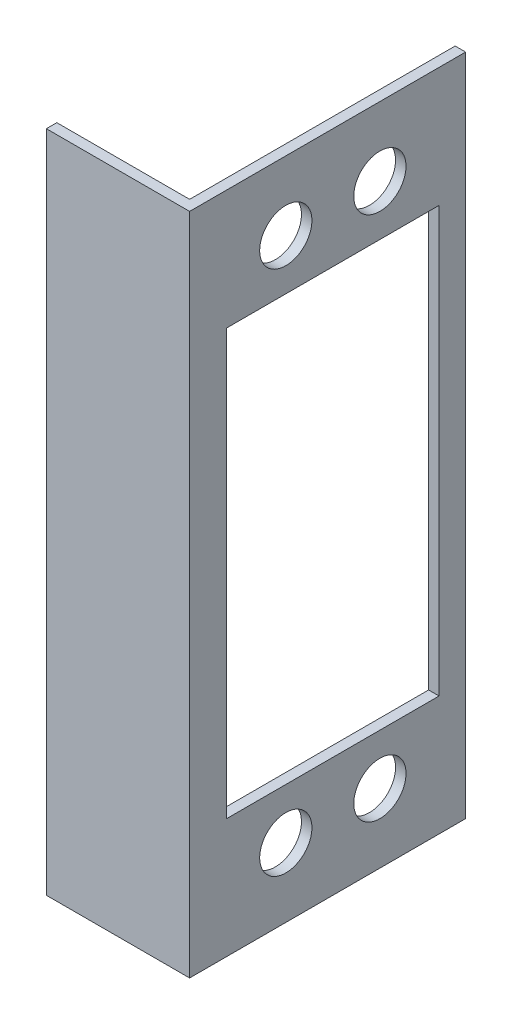
ISO-10303-21;
HEADER;
FILE_DESCRIPTION(('STEP AP214'),'2;1');
FILE_NAME('part.step','',(''),(''),'','','');
FILE_SCHEMA(('AUTOMOTIVE_DESIGN { 1 0 10303 214 1 1 1 1 }'));
ENDSEC;
DATA;
#1=APPLICATION_CONTEXT('core data for automotive mechanical design processes');
#2=APPLICATION_PROTOCOL_DEFINITION('international standard','automotive_design',2000,#1);
#3=PRODUCT_CONTEXT('',#1,'mechanical');
#4=PRODUCT('Part','Part','',(#3));
#5=PRODUCT_RELATED_PRODUCT_CATEGORY('part','',(#4));
#6=PRODUCT_DEFINITION_FORMATION('','',#4);
#7=PRODUCT_DEFINITION_CONTEXT('part definition',#1,'design');
#8=PRODUCT_DEFINITION('design','',#6,#7);
#9=PRODUCT_DEFINITION_SHAPE('','',#8);
#10=(LENGTH_UNIT() NAMED_UNIT(*) SI_UNIT(.MILLI.,.METRE.));
#11=(NAMED_UNIT(*) PLANE_ANGLE_UNIT() SI_UNIT($,.RADIAN.));
#12=(NAMED_UNIT(*) SI_UNIT($,.STERADIAN.) SOLID_ANGLE_UNIT());
#13=UNCERTAINTY_MEASURE_WITH_UNIT(LENGTH_MEASURE(1.E-05),#10,'distance_accuracy_value','');
#14=(GEOMETRIC_REPRESENTATION_CONTEXT(3) GLOBAL_UNCERTAINTY_ASSIGNED_CONTEXT((#13)) GLOBAL_UNIT_ASSIGNED_CONTEXT((#10,
#11,#12)) REPRESENTATION_CONTEXT('',''));
#15=CARTESIAN_POINT('',(0.,0.,0.));
#16=DIRECTION('',(0.,0.,1.));
#17=DIRECTION('',(1.,0.,0.));
#18=AXIS2_PLACEMENT_3D('',#15,#16,#17);
#19=CARTESIAN_POINT('',(12.7,63.5,0.));
#20=DIRECTION('',(-1.,0.,0.));
#21=DIRECTION('',(0.,0.,1.));
#22=AXIS2_PLACEMENT_3D('',#19,#20,#21);
#23=PLANE('',#22);
#24=CARTESIAN_POINT('',(12.7,6.6,-9.20000000000001));
#25=DIRECTION('',(-1.,0.,0.));
#26=DIRECTION('',(0.,0.,1.));
#27=AXIS2_PLACEMENT_3D('',#24,#25,#26);
#28=CIRCLE('',#27,2.5);
#29=CARTESIAN_POINT('',(12.7,6.6,-6.70000000000001));
#30=VERTEX_POINT('',#29);
#31=EDGE_CURVE('E235',#30,#30,#28,.T.);
#32=ORIENTED_EDGE('',*,*,#31,.F.);
#33=EDGE_LOOP('',(#32));
#34=FACE_BOUND('',#33,.T.);
#35=CARTESIAN_POINT('',(12.7,56.9,-18.2));
#36=DIRECTION('',(-1.,0.,0.));
#37=DIRECTION('',(0.,0.,1.));
#38=AXIS2_PLACEMENT_3D('',#35,#36,#37);
#39=CIRCLE('',#38,2.5);
#40=CARTESIAN_POINT('',(12.7,56.9,-15.7));
#41=VERTEX_POINT('',#40);
#42=EDGE_CURVE('E239',#41,#41,#39,.T.);
#43=ORIENTED_EDGE('',*,*,#42,.F.);
#44=EDGE_LOOP('',(#43));
#45=FACE_BOUND('',#44,.T.);
#46=CARTESIAN_POINT('',(12.7,56.9,-9.20000000000001));
#47=DIRECTION('',(-1.,0.,0.));
#48=DIRECTION('',(0.,0.,1.));
#49=AXIS2_PLACEMENT_3D('',#46,#47,#48);
#50=CIRCLE('',#49,2.5);
#51=CARTESIAN_POINT('',(12.7,56.9,-6.7));
#52=VERTEX_POINT('',#51);
#53=EDGE_CURVE('E243',#52,#52,#50,.T.);
#54=ORIENTED_EDGE('',*,*,#53,.F.);
#55=EDGE_LOOP('',(#54));
#56=FACE_BOUND('',#55,.T.);
#57=CARTESIAN_POINT('',(12.7,6.6,-18.2));
#58=DIRECTION('',(-1.,0.,0.));
#59=DIRECTION('',(0.,0.,1.));
#60=AXIS2_PLACEMENT_3D('',#57,#58,#59);
#61=CIRCLE('',#60,2.5);
#62=CARTESIAN_POINT('',(12.7,6.6,-15.7));
#63=VERTEX_POINT('',#62);
#64=EDGE_CURVE('E247',#63,#63,#61,.T.);
#65=ORIENTED_EDGE('',*,*,#64,.F.);
#66=EDGE_LOOP('',(#65));
#67=FACE_BOUND('',#66,.T.);
#68=DIRECTION('',(0.,-1.,0.));
#69=VECTOR('',#68,1.);
#70=CARTESIAN_POINT('',(12.7,52.07,-23.86));
#71=LINE('',#70,#69);
#72=CARTESIAN_POINT('',(12.7,52.07,-23.86));
#73=VERTEX_POINT('',#72);
#74=CARTESIAN_POINT('',(12.7,11.43,-23.86));
#75=VERTEX_POINT('',#74);
#76=EDGE_CURVE('E49',#73,#75,#71,.T.);
#77=ORIENTED_EDGE('',*,*,#76,.F.);
#78=DIRECTION('',(0.,0.,-1.));
#79=VECTOR('',#78,1.);
#80=CARTESIAN_POINT('',(12.7,52.07,-23.86));
#81=LINE('',#80,#79);
#82=CARTESIAN_POINT('',(12.7,52.07,-3.54));
#83=VERTEX_POINT('',#82);
#84=EDGE_CURVE('E128',#83,#73,#81,.T.);
#85=ORIENTED_EDGE('',*,*,#84,.F.);
#86=DIRECTION('',(0.,1.,0.));
#87=VECTOR('',#86,1.);
#88=CARTESIAN_POINT('',(12.7,52.07,-3.54));
#89=LINE('',#88,#87);
#90=CARTESIAN_POINT('',(12.7,11.43,-3.54));
#91=VERTEX_POINT('',#90);
#92=EDGE_CURVE('E131',#91,#83,#89,.T.);
#93=ORIENTED_EDGE('',*,*,#92,.F.);
#94=DIRECTION('',(0.,0.,1.));
#95=VECTOR('',#94,1.);
#96=CARTESIAN_POINT('',(12.7,11.43,-23.86));
#97=LINE('',#96,#95);
#98=EDGE_CURVE('E140',#75,#91,#97,.T.);
#99=ORIENTED_EDGE('',*,*,#98,.F.);
#100=EDGE_LOOP('',(#77,#85,#93,#99));
#101=FACE_BOUND('',#100,.T.);
#102=DIRECTION('',(0.,0.,-1.));
#103=VECTOR('',#102,1.);
#104=CARTESIAN_POINT('',(12.7,0.,0.));
#105=LINE('',#104,#103);
#106=CARTESIAN_POINT('',(12.7,0.,-1.));
#107=VERTEX_POINT('',#106);
#108=CARTESIAN_POINT('',(12.7,0.,-26.4));
#109=VERTEX_POINT('',#108);
#110=EDGE_CURVE('E146',#107,#109,#105,.T.);
#111=ORIENTED_EDGE('',*,*,#110,.F.);
#112=DIRECTION('',(0.,-1.,0.));
#113=VECTOR('',#112,1.);
#114=CARTESIAN_POINT('',(12.7,63.5,-1.));
#115=LINE('',#114,#113);
#116=CARTESIAN_POINT('',(12.7,63.5,-1.));
#117=VERTEX_POINT('',#116);
#118=EDGE_CURVE('E11',#117,#107,#115,.T.);
#119=ORIENTED_EDGE('',*,*,#118,.F.);
#120=DIRECTION('',(0.,0.,-1.));
#121=VECTOR('',#120,1.);
#122=CARTESIAN_POINT('',(12.7,63.5,0.));
#123=LINE('',#122,#121);
#124=CARTESIAN_POINT('',(12.7,63.5,-26.4));
#125=VERTEX_POINT('',#124);
#126=EDGE_CURVE('E150',#117,#125,#123,.T.);
#127=ORIENTED_EDGE('',*,*,#126,.T.);
#128=DIRECTION('',(0.,-1.,0.));
#129=VECTOR('',#128,1.);
#130=CARTESIAN_POINT('',(12.7,63.5,-26.4));
#131=LINE('',#130,#129);
#132=EDGE_CURVE('E166',#125,#109,#131,.T.);
#133=ORIENTED_EDGE('',*,*,#132,.T.);
#134=EDGE_LOOP('',(#111,#119,#127,#133));
#135=FACE_BOUND('',#134,.T.);
#136=ADVANCED_FACE('F35',(#34,#45,#56,#67,#101,#135),#23,.T.);
#137=CARTESIAN_POINT('',(0.,63.5,-1.));
#138=DIRECTION('',(0.,0.,-1.));
#139=DIRECTION('',(-1.,0.,0.));
#140=AXIS2_PLACEMENT_3D('',#137,#138,#139);
#141=PLANE('',#140);
#142=DIRECTION('',(1.,0.,0.));
#143=VECTOR('',#142,1.);
#144=CARTESIAN_POINT('',(0.,0.,-1.));
#145=LINE('',#144,#143);
#146=CARTESIAN_POINT('',(0.,0.,-1.));
#147=VERTEX_POINT('',#146);
#148=EDGE_CURVE('E169',#147,#107,#145,.T.);
#149=ORIENTED_EDGE('',*,*,#148,.F.);
#150=DIRECTION('',(0.,-1.,0.));
#151=VECTOR('',#150,1.);
#152=CARTESIAN_POINT('',(0.,63.5,-1.));
#153=LINE('',#152,#151);
#154=CARTESIAN_POINT('',(0.,63.5,-1.));
#155=VERTEX_POINT('',#154);
#156=EDGE_CURVE('E42',#155,#147,#153,.T.);
#157=ORIENTED_EDGE('',*,*,#156,.F.);
#158=DIRECTION('',(1.,0.,0.));
#159=VECTOR('',#158,1.);
#160=CARTESIAN_POINT('',(0.,63.5,-1.));
#161=LINE('',#160,#159);
#162=EDGE_CURVE('E153',#155,#117,#161,.T.);
#163=ORIENTED_EDGE('',*,*,#162,.T.);
#164=ORIENTED_EDGE('',*,*,#118,.T.);
#165=EDGE_LOOP('',(#149,#157,#163,#164));
#166=FACE_BOUND('',#165,.T.);
#167=ADVANCED_FACE('F196',(#166),#141,.T.);
#168=CARTESIAN_POINT('',(0.,63.5,0.));
#169=DIRECTION('',(-1.,0.,0.));
#170=DIRECTION('',(0.,0.,1.));
#171=AXIS2_PLACEMENT_3D('',#168,#169,#170);
#172=PLANE('',#171);
#173=DIRECTION('',(0.,0.,-1.));
#174=VECTOR('',#173,1.);
#175=CARTESIAN_POINT('',(0.,0.,0.));
#176=LINE('',#175,#174);
#177=CARTESIAN_POINT('',(0.,0.,0.));
#178=VERTEX_POINT('',#177);
#179=EDGE_CURVE('E172',#178,#147,#176,.T.);
#180=ORIENTED_EDGE('',*,*,#179,.F.);
#181=DIRECTION('',(0.,-1.,0.));
#182=VECTOR('',#181,1.);
#183=CARTESIAN_POINT('',(0.,63.5,0.));
#184=LINE('',#183,#182);
#185=CARTESIAN_POINT('',(0.,63.5,0.));
#186=VERTEX_POINT('',#185);
#187=EDGE_CURVE('E188',#186,#178,#184,.T.);
#188=ORIENTED_EDGE('',*,*,#187,.F.);
#189=DIRECTION('',(0.,0.,-1.));
#190=VECTOR('',#189,1.);
#191=CARTESIAN_POINT('',(0.,63.5,0.));
#192=LINE('',#191,#190);
#193=EDGE_CURVE('E157',#186,#155,#192,.T.);
#194=ORIENTED_EDGE('',*,*,#193,.T.);
#195=ORIENTED_EDGE('',*,*,#156,.T.);
#196=EDGE_LOOP('',(#180,#188,#194,#195));
#197=FACE_BOUND('',#196,.T.);
#198=ADVANCED_FACE('F192',(#197),#172,.T.);
#199=CARTESIAN_POINT('',(0.,63.5,0.));
#200=DIRECTION('',(0.,0.,-1.));
#201=DIRECTION('',(-1.,0.,0.));
#202=AXIS2_PLACEMENT_3D('',#199,#200,#201);
#203=PLANE('',#202);
#204=DIRECTION('',(1.,0.,0.));
#205=VECTOR('',#204,1.);
#206=CARTESIAN_POINT('',(0.,0.,0.));
#207=LINE('',#206,#205);
#208=CARTESIAN_POINT('',(13.7,0.,0.));
#209=VERTEX_POINT('',#208);
#210=EDGE_CURVE('E175',#178,#209,#207,.T.);
#211=ORIENTED_EDGE('',*,*,#210,.T.);
#212=DIRECTION('',(0.,-1.,0.));
#213=VECTOR('',#212,1.);
#214=CARTESIAN_POINT('',(13.7,63.5,0.));
#215=LINE('',#214,#213);
#216=CARTESIAN_POINT('',(13.7,63.5,0.));
#217=VERTEX_POINT('',#216);
#218=EDGE_CURVE('E185',#217,#209,#215,.T.);
#219=ORIENTED_EDGE('',*,*,#218,.F.);
#220=DIRECTION('',(1.,0.,0.));
#221=VECTOR('',#220,1.);
#222=CARTESIAN_POINT('',(0.,63.5,0.));
#223=LINE('',#222,#221);
#224=EDGE_CURVE('E160',#186,#217,#223,.T.);
#225=ORIENTED_EDGE('',*,*,#224,.F.);
#226=ORIENTED_EDGE('',*,*,#187,.T.);
#227=EDGE_LOOP('',(#211,#219,#225,#226));
#228=FACE_BOUND('',#227,.T.);
#229=ADVANCED_FACE('F205',(#228),#203,.F.);
#230=CARTESIAN_POINT('',(13.7,63.5,0.));
#231=DIRECTION('',(-1.,0.,0.));
#232=DIRECTION('',(0.,0.,1.));
#233=AXIS2_PLACEMENT_3D('',#230,#231,#232);
#234=PLANE('',#233);
#235=CARTESIAN_POINT('',(13.7,6.6,-9.20000000000001));
#236=DIRECTION('',(-1.,0.,0.));
#237=DIRECTION('',(0.,0.,1.));
#238=AXIS2_PLACEMENT_3D('',#235,#236,#237);
#239=CIRCLE('',#238,2.5);
#240=CARTESIAN_POINT('',(13.7,6.6,-6.70000000000001));
#241=VERTEX_POINT('',#240);
#242=EDGE_CURVE('E349',#241,#241,#239,.T.);
#243=ORIENTED_EDGE('',*,*,#242,.T.);
#244=EDGE_LOOP('',(#243));
#245=FACE_BOUND('',#244,.T.);
#246=CARTESIAN_POINT('',(13.7,56.9,-18.2));
#247=DIRECTION('',(-1.,0.,0.));
#248=DIRECTION('',(0.,0.,1.));
#249=AXIS2_PLACEMENT_3D('',#246,#247,#248);
#250=CIRCLE('',#249,2.5);
#251=CARTESIAN_POINT('',(13.7,56.9,-15.7));
#252=VERTEX_POINT('',#251);
#253=EDGE_CURVE('E354',#252,#252,#250,.T.);
#254=ORIENTED_EDGE('',*,*,#253,.T.);
#255=EDGE_LOOP('',(#254));
#256=FACE_BOUND('',#255,.T.);
#257=CARTESIAN_POINT('',(13.7,56.9,-9.20000000000001));
#258=DIRECTION('',(-1.,0.,0.));
#259=DIRECTION('',(0.,0.,1.));
#260=AXIS2_PLACEMENT_3D('',#257,#258,#259);
#261=CIRCLE('',#260,2.5);
#262=CARTESIAN_POINT('',(13.7,56.9,-6.7));
#263=VERTEX_POINT('',#262);
#264=EDGE_CURVE('E358',#263,#263,#261,.T.);
#265=ORIENTED_EDGE('',*,*,#264,.T.);
#266=EDGE_LOOP('',(#265));
#267=FACE_BOUND('',#266,.T.);
#268=CARTESIAN_POINT('',(13.7,6.6,-18.2));
#269=DIRECTION('',(-1.,0.,0.));
#270=DIRECTION('',(0.,0.,1.));
#271=AXIS2_PLACEMENT_3D('',#268,#269,#270);
#272=CIRCLE('',#271,2.5);
#273=CARTESIAN_POINT('',(13.7,6.6,-15.7));
#274=VERTEX_POINT('',#273);
#275=EDGE_CURVE('E134',#274,#274,#272,.T.);
#276=ORIENTED_EDGE('',*,*,#275,.T.);
#277=EDGE_LOOP('',(#276));
#278=FACE_BOUND('',#277,.T.);
#279=DIRECTION('',(0.,0.,-1.));
#280=VECTOR('',#279,1.);
#281=CARTESIAN_POINT('',(13.7,52.07,-23.86));
#282=LINE('',#281,#280);
#283=CARTESIAN_POINT('',(13.7,52.07,-3.54));
#284=VERTEX_POINT('',#283);
#285=CARTESIAN_POINT('',(13.7,52.07,-23.86));
#286=VERTEX_POINT('',#285);
#287=EDGE_CURVE('E118',#284,#286,#282,.T.);
#288=ORIENTED_EDGE('',*,*,#287,.T.);
#289=DIRECTION('',(0.,-1.,0.));
#290=VECTOR('',#289,1.);
#291=CARTESIAN_POINT('',(13.7,52.07,-23.86));
#292=LINE('',#291,#290);
#293=CARTESIAN_POINT('',(13.7,11.43,-23.86));
#294=VERTEX_POINT('',#293);
#295=EDGE_CURVE('E112',#286,#294,#292,.T.);
#296=ORIENTED_EDGE('',*,*,#295,.T.);
#297=DIRECTION('',(0.,0.,1.));
#298=VECTOR('',#297,1.);
#299=CARTESIAN_POINT('',(13.7,11.43,-23.86));
#300=LINE('',#299,#298);
#301=CARTESIAN_POINT('',(13.7,11.43,-3.54));
#302=VERTEX_POINT('',#301);
#303=EDGE_CURVE('E121',#294,#302,#300,.T.);
#304=ORIENTED_EDGE('',*,*,#303,.T.);
#305=DIRECTION('',(0.,1.,0.));
#306=VECTOR('',#305,1.);
#307=CARTESIAN_POINT('',(13.7,52.07,-3.54));
#308=LINE('',#307,#306);
#309=EDGE_CURVE('E57',#302,#284,#308,.T.);
#310=ORIENTED_EDGE('',*,*,#309,.T.);
#311=EDGE_LOOP('',(#288,#296,#304,#310));
#312=FACE_BOUND('',#311,.T.);
#313=DIRECTION('',(0.,0.,-1.));
#314=VECTOR('',#313,1.);
#315=CARTESIAN_POINT('',(13.7,0.,0.));
#316=LINE('',#315,#314);
#317=CARTESIAN_POINT('',(13.7,0.,-26.4));
#318=VERTEX_POINT('',#317);
#319=EDGE_CURVE('E177',#209,#318,#316,.T.);
#320=ORIENTED_EDGE('',*,*,#319,.T.);
#321=DIRECTION('',(0.,-1.,0.));
#322=VECTOR('',#321,1.);
#323=CARTESIAN_POINT('',(13.7,63.5,-26.4));
#324=LINE('',#323,#322);
#325=CARTESIAN_POINT('',(13.7,63.5,-26.4));
#326=VERTEX_POINT('',#325);
#327=EDGE_CURVE('E182',#326,#318,#324,.T.);
#328=ORIENTED_EDGE('',*,*,#327,.F.);
#329=DIRECTION('',(0.,0.,-1.));
#330=VECTOR('',#329,1.);
#331=CARTESIAN_POINT('',(13.7,63.5,0.));
#332=LINE('',#331,#330);
#333=EDGE_CURVE('E162',#217,#326,#332,.T.);
#334=ORIENTED_EDGE('',*,*,#333,.F.);
#335=ORIENTED_EDGE('',*,*,#218,.T.);
#336=EDGE_LOOP('',(#320,#328,#334,#335));
#337=FACE_BOUND('',#336,.T.);
#338=ADVANCED_FACE('F125',(#245,#256,#267,#278,#312,#337),#234,.F.);
#339=CARTESIAN_POINT('',(0.,63.5,-26.4));
#340=DIRECTION('',(0.,0.,1.));
#341=DIRECTION('',(1.,0.,0.));
#342=AXIS2_PLACEMENT_3D('',#339,#340,#341);
#343=PLANE('',#342);
#344=DIRECTION('',(-1.,0.,0.));
#345=VECTOR('',#344,1.);
#346=CARTESIAN_POINT('',(0.,0.,-26.4));
#347=LINE('',#346,#345);
#348=EDGE_CURVE('E154',#318,#109,#347,.T.);
#349=ORIENTED_EDGE('',*,*,#348,.T.);
#350=ORIENTED_EDGE('',*,*,#132,.F.);
#351=DIRECTION('',(-1.,0.,0.));
#352=VECTOR('',#351,1.);
#353=CARTESIAN_POINT('',(0.,63.5,-26.4));
#354=LINE('',#353,#352);
#355=EDGE_CURVE('E164',#326,#125,#354,.T.);
#356=ORIENTED_EDGE('',*,*,#355,.F.);
#357=ORIENTED_EDGE('',*,*,#327,.T.);
#358=EDGE_LOOP('',(#349,#350,#356,#357));
#359=FACE_BOUND('',#358,.T.);
#360=ADVANCED_FACE('F216',(#359),#343,.F.);
#361=CARTESIAN_POINT('',(0.,63.5,0.));
#362=DIRECTION('',(0.,1.,0.));
#363=DIRECTION('',(0.,0.,1.));
#364=AXIS2_PLACEMENT_3D('',#361,#362,#363);
#365=PLANE('',#364);
#366=ORIENTED_EDGE('',*,*,#126,.F.);
#367=ORIENTED_EDGE('',*,*,#162,.F.);
#368=ORIENTED_EDGE('',*,*,#193,.F.);
#369=ORIENTED_EDGE('',*,*,#224,.T.);
#370=ORIENTED_EDGE('',*,*,#333,.T.);
#371=ORIENTED_EDGE('',*,*,#355,.T.);
#372=EDGE_LOOP('',(#366,#367,#368,#369,#370,#371));
#373=FACE_BOUND('',#372,.T.);
#374=ADVANCED_FACE('F212',(#373),#365,.T.);
#375=CARTESIAN_POINT('',(0.,0.,0.));
#376=DIRECTION('',(0.,1.,0.));
#377=DIRECTION('',(0.,0.,1.));
#378=AXIS2_PLACEMENT_3D('',#375,#376,#377);
#379=PLANE('',#378);
#380=ORIENTED_EDGE('',*,*,#110,.T.);
#381=ORIENTED_EDGE('',*,*,#348,.F.);
#382=ORIENTED_EDGE('',*,*,#319,.F.);
#383=ORIENTED_EDGE('',*,*,#210,.F.);
#384=ORIENTED_EDGE('',*,*,#179,.T.);
#385=ORIENTED_EDGE('',*,*,#148,.T.);
#386=EDGE_LOOP('',(#380,#381,#382,#383,#384,#385));
#387=FACE_BOUND('',#386,.T.);
#388=ADVANCED_FACE('F200',(#387),#379,.F.);
#389=CARTESIAN_POINT('',(13.7,52.07,-23.86));
#390=DIRECTION('',(0.,0.,-1.));
#391=DIRECTION('',(-1.,0.,0.));
#392=AXIS2_PLACEMENT_3D('',#389,#390,#391);
#393=PLANE('',#392);
#394=ORIENTED_EDGE('',*,*,#76,.T.);
#395=DIRECTION('',(-1.,0.,0.));
#396=VECTOR('',#395,1.);
#397=CARTESIAN_POINT('',(13.7,11.43,-23.86));
#398=LINE('',#397,#396);
#399=EDGE_CURVE('E108',#294,#75,#398,.T.);
#400=ORIENTED_EDGE('',*,*,#399,.F.);
#401=ORIENTED_EDGE('',*,*,#295,.F.);
#402=DIRECTION('',(-1.,0.,0.));
#403=VECTOR('',#402,1.);
#404=CARTESIAN_POINT('',(13.7,52.07,-23.86));
#405=LINE('',#404,#403);
#406=EDGE_CURVE('E144',#286,#73,#405,.T.);
#407=ORIENTED_EDGE('',*,*,#406,.T.);
#408=EDGE_LOOP('',(#394,#400,#401,#407));
#409=FACE_BOUND('',#408,.T.);
#410=ADVANCED_FACE('F110',(#409),#393,.F.);
#411=CARTESIAN_POINT('',(13.7,52.07,-23.86));
#412=DIRECTION('',(0.,1.,0.));
#413=DIRECTION('',(0.,0.,1.));
#414=AXIS2_PLACEMENT_3D('',#411,#412,#413);
#415=PLANE('',#414);
#416=ORIENTED_EDGE('',*,*,#84,.T.);
#417=ORIENTED_EDGE('',*,*,#406,.F.);
#418=ORIENTED_EDGE('',*,*,#287,.F.);
#419=DIRECTION('',(-1.,0.,0.));
#420=VECTOR('',#419,1.);
#421=CARTESIAN_POINT('',(13.7,52.07,-3.54));
#422=LINE('',#421,#420);
#423=EDGE_CURVE('E147',#284,#83,#422,.T.);
#424=ORIENTED_EDGE('',*,*,#423,.T.);
#425=EDGE_LOOP('',(#416,#417,#418,#424));
#426=FACE_BOUND('',#425,.T.);
#427=ADVANCED_FACE('F252',(#426),#415,.F.);
#428=CARTESIAN_POINT('',(13.7,52.07,-3.54));
#429=DIRECTION('',(0.,0.,1.));
#430=DIRECTION('',(0.,-1.,0.));
#431=AXIS2_PLACEMENT_3D('',#428,#429,#430);
#432=PLANE('',#431);
#433=ORIENTED_EDGE('',*,*,#92,.T.);
#434=ORIENTED_EDGE('',*,*,#423,.F.);
#435=ORIENTED_EDGE('',*,*,#309,.F.);
#436=DIRECTION('',(-1.,0.,0.));
#437=VECTOR('',#436,1.);
#438=CARTESIAN_POINT('',(13.7,11.43,-3.54));
#439=LINE('',#438,#437);
#440=EDGE_CURVE('E117',#302,#91,#439,.T.);
#441=ORIENTED_EDGE('',*,*,#440,.T.);
#442=EDGE_LOOP('',(#433,#434,#435,#441));
#443=FACE_BOUND('',#442,.T.);
#444=ADVANCED_FACE('F250',(#443),#432,.F.);
#445=CARTESIAN_POINT('',(13.7,11.43,-23.86));
#446=DIRECTION('',(0.,-1.,0.));
#447=DIRECTION('',(0.,0.,-1.));
#448=AXIS2_PLACEMENT_3D('',#445,#446,#447);
#449=PLANE('',#448);
#450=ORIENTED_EDGE('',*,*,#98,.T.);
#451=ORIENTED_EDGE('',*,*,#440,.F.);
#452=ORIENTED_EDGE('',*,*,#303,.F.);
#453=ORIENTED_EDGE('',*,*,#399,.T.);
#454=EDGE_LOOP('',(#450,#451,#452,#453));
#455=FACE_BOUND('',#454,.T.);
#456=ADVANCED_FACE('F122',(#455),#449,.F.);
#457=CARTESIAN_POINT('',(12.7,6.6,-18.2));
#458=DIRECTION('',(-1.,0.,0.));
#459=DIRECTION('',(0.,0.,1.));
#460=AXIS2_PLACEMENT_3D('',#457,#458,#459);
#461=CYLINDRICAL_SURFACE('',#460,2.5);
#462=ORIENTED_EDGE('',*,*,#275,.F.);
#463=EDGE_LOOP('',(#462));
#464=FACE_BOUND('',#463,.T.);
#465=ORIENTED_EDGE('',*,*,#64,.T.);
#466=EDGE_LOOP('',(#465));
#467=FACE_BOUND('',#466,.T.);
#468=ADVANCED_FACE('F262',(#464,#467),#461,.F.);
#469=CARTESIAN_POINT('',(12.7,56.9,-9.20000000000001));
#470=DIRECTION('',(-1.,0.,0.));
#471=DIRECTION('',(0.,0.,1.));
#472=AXIS2_PLACEMENT_3D('',#469,#470,#471);
#473=CYLINDRICAL_SURFACE('',#472,2.5);
#474=ORIENTED_EDGE('',*,*,#264,.F.);
#475=EDGE_LOOP('',(#474));
#476=FACE_BOUND('',#475,.T.);
#477=ORIENTED_EDGE('',*,*,#53,.T.);
#478=EDGE_LOOP('',(#477));
#479=FACE_BOUND('',#478,.T.);
#480=ADVANCED_FACE('F314',(#476,#479),#473,.F.);
#481=CARTESIAN_POINT('',(12.7,56.9,-18.2));
#482=DIRECTION('',(-1.,0.,0.));
#483=DIRECTION('',(0.,0.,1.));
#484=AXIS2_PLACEMENT_3D('',#481,#482,#483);
#485=CYLINDRICAL_SURFACE('',#484,2.5);
#486=ORIENTED_EDGE('',*,*,#253,.F.);
#487=EDGE_LOOP('',(#486));
#488=FACE_BOUND('',#487,.T.);
#489=ORIENTED_EDGE('',*,*,#42,.T.);
#490=EDGE_LOOP('',(#489));
#491=FACE_BOUND('',#490,.T.);
#492=ADVANCED_FACE('F323',(#488,#491),#485,.F.);
#493=CARTESIAN_POINT('',(12.7,6.6,-9.20000000000001));
#494=DIRECTION('',(-1.,0.,0.));
#495=DIRECTION('',(0.,0.,1.));
#496=AXIS2_PLACEMENT_3D('',#493,#494,#495);
#497=CYLINDRICAL_SURFACE('',#496,2.5);
#498=ORIENTED_EDGE('',*,*,#242,.F.);
#499=EDGE_LOOP('',(#498));
#500=FACE_BOUND('',#499,.T.);
#501=ORIENTED_EDGE('',*,*,#31,.T.);
#502=EDGE_LOOP('',(#501));
#503=FACE_BOUND('',#502,.T.);
#504=ADVANCED_FACE('F332',(#500,#503),#497,.F.);
#505=CLOSED_SHELL('',(#136,#167,#198,#229,#338,#360,#374,#388,#410,#427,#444,#456,#468,#480,
#492,#504));
#506=MANIFOLD_SOLID_BREP('B2',#505);
#507=ADVANCED_BREP_SHAPE_REPRESENTATION('',(#18,#506),#14);
#508=SHAPE_DEFINITION_REPRESENTATION(#9,#507);
ENDSEC;
END-ISO-10303-21;
